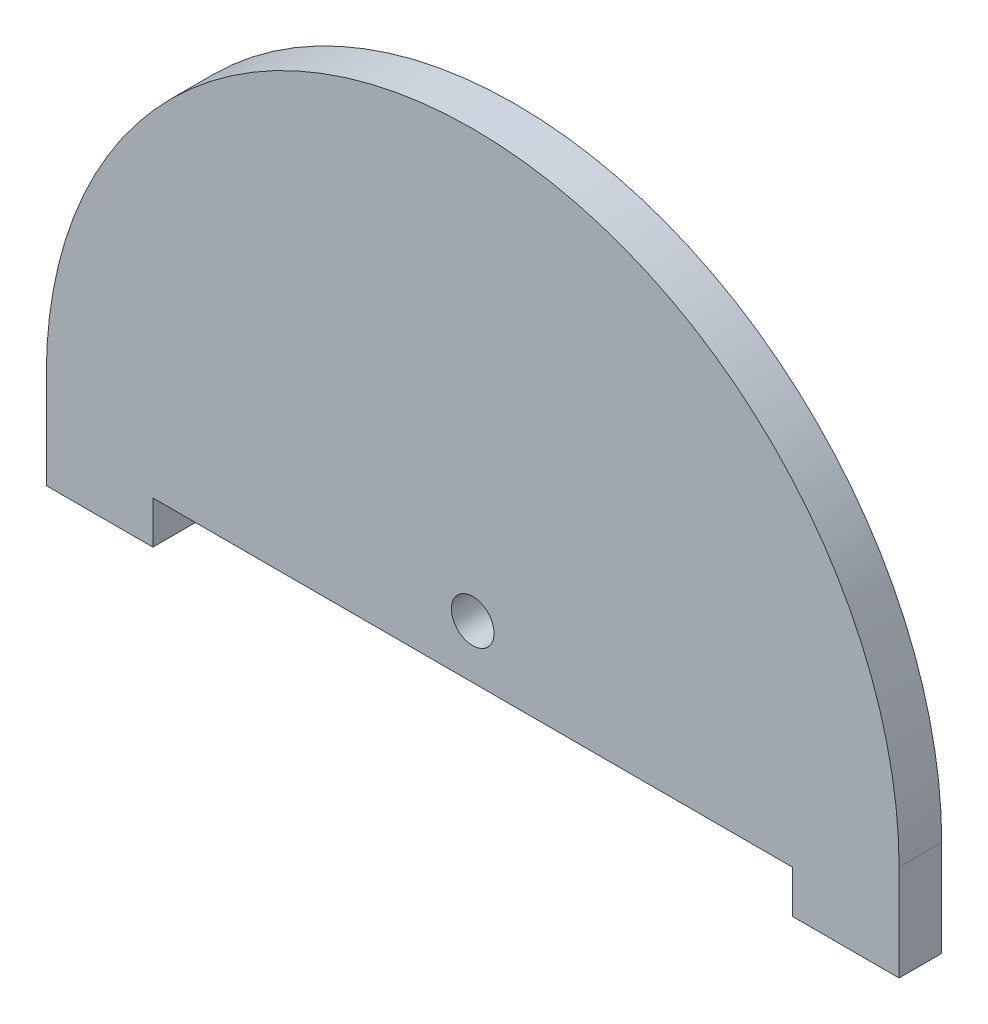
ISO-10303-21;
HEADER;
FILE_DESCRIPTION(('STEP AP214'),'2;1');
FILE_NAME('part.step','',(''),(''),'','','');
FILE_SCHEMA(('AUTOMOTIVE_DESIGN { 1 0 10303 214 1 1 1 1 }'));
ENDSEC;
DATA;
#1=APPLICATION_CONTEXT('core data for automotive mechanical design processes');
#2=APPLICATION_PROTOCOL_DEFINITION('international standard','automotive_design',2000,#1);
#3=PRODUCT_CONTEXT('',#1,'mechanical');
#4=PRODUCT('Part','Part','',(#3));
#5=PRODUCT_RELATED_PRODUCT_CATEGORY('part','',(#4));
#6=PRODUCT_DEFINITION_FORMATION('','',#4);
#7=PRODUCT_DEFINITION_CONTEXT('part definition',#1,'design');
#8=PRODUCT_DEFINITION('design','',#6,#7);
#9=PRODUCT_DEFINITION_SHAPE('','',#8);
#10=(LENGTH_UNIT() NAMED_UNIT(*) SI_UNIT(.MILLI.,.METRE.));
#11=(NAMED_UNIT(*) PLANE_ANGLE_UNIT() SI_UNIT($,.RADIAN.));
#12=(NAMED_UNIT(*) SI_UNIT($,.STERADIAN.) SOLID_ANGLE_UNIT());
#13=UNCERTAINTY_MEASURE_WITH_UNIT(LENGTH_MEASURE(1.E-05),#10,'distance_accuracy_value','');
#14=(GEOMETRIC_REPRESENTATION_CONTEXT(3) GLOBAL_UNCERTAINTY_ASSIGNED_CONTEXT((#13)) GLOBAL_UNIT_ASSIGNED_CONTEXT((#10,
#11,#12)) REPRESENTATION_CONTEXT('',''));
#15=CARTESIAN_POINT('',(0.,0.,0.));
#16=DIRECTION('',(0.,0.,1.));
#17=DIRECTION('',(1.,0.,0.));
#18=AXIS2_PLACEMENT_3D('',#15,#16,#17);
#19=CARTESIAN_POINT('',(0.,0.,8.));
#20=DIRECTION('',(0.,0.,-1.));
#21=DIRECTION('',(-1.,0.,0.));
#22=AXIS2_PLACEMENT_3D('',#19,#20,#21);
#23=CYLINDRICAL_SURFACE('',#22,80.);
#24=CARTESIAN_POINT('',(0.,0.,0.));
#25=DIRECTION('',(0.,0.,1.));
#26=DIRECTION('',(-1.,0.,0.));
#27=AXIS2_PLACEMENT_3D('',#24,#25,#26);
#28=CIRCLE('',#27,80.);
#29=CARTESIAN_POINT('',(80.,0.,0.));
#30=VERTEX_POINT('',#29);
#31=CARTESIAN_POINT('',(-80.,0.,0.));
#32=VERTEX_POINT('',#31);
#33=EDGE_CURVE('E164',#30,#32,#28,.T.);
#34=ORIENTED_EDGE('',*,*,#33,.T.);
#35=DIRECTION('',(0.,0.,-1.));
#36=VECTOR('',#35,1.);
#37=CARTESIAN_POINT('',(-80.,0.,8.));
#38=LINE('',#37,#36);
#39=CARTESIAN_POINT('',(-80.,0.,8.));
#40=VERTEX_POINT('',#39);
#41=EDGE_CURVE('E11',#40,#32,#38,.T.);
#42=ORIENTED_EDGE('',*,*,#41,.F.);
#43=CARTESIAN_POINT('',(0.,0.,8.));
#44=DIRECTION('',(0.,0.,1.));
#45=DIRECTION('',(-1.,0.,0.));
#46=AXIS2_PLACEMENT_3D('',#43,#44,#45);
#47=CIRCLE('',#46,80.);
#48=CARTESIAN_POINT('',(80.,0.,8.));
#49=VERTEX_POINT('',#48);
#50=EDGE_CURVE('E165',#49,#40,#47,.T.);
#51=ORIENTED_EDGE('',*,*,#50,.F.);
#52=DIRECTION('',(0.,0.,-1.));
#53=VECTOR('',#52,1.);
#54=CARTESIAN_POINT('',(80.,0.,8.));
#55=LINE('',#54,#53);
#56=EDGE_CURVE('E44',#49,#30,#55,.T.);
#57=ORIENTED_EDGE('',*,*,#56,.T.);
#58=EDGE_LOOP('',(#34,#42,#51,#57));
#59=FACE_BOUND('',#58,.T.);
#60=ADVANCED_FACE('F37',(#59),#23,.T.);
#61=CARTESIAN_POINT('',(0.,0.,8.));
#62=DIRECTION('',(0.,0.,-1.));
#63=DIRECTION('',(-1.,0.,0.));
#64=AXIS2_PLACEMENT_3D('',#61,#62,#63);
#65=PLANE('',#64);
#66=CARTESIAN_POINT('',(0.,0.,8.));
#67=DIRECTION('',(0.,0.,1.));
#68=DIRECTION('',(1.,0.,0.));
#69=AXIS2_PLACEMENT_3D('',#66,#67,#68);
#70=CIRCLE('',#69,4.);
#71=CARTESIAN_POINT('',(4.,0.,8.));
#72=VERTEX_POINT('',#71);
#73=EDGE_CURVE('E273',#72,#72,#70,.T.);
#74=ORIENTED_EDGE('',*,*,#73,.F.);
#75=EDGE_LOOP('',(#74));
#76=FACE_BOUND('',#75,.T.);
#77=ORIENTED_EDGE('',*,*,#50,.T.);
#78=DIRECTION('',(0.,1.,0.));
#79=VECTOR('',#78,1.);
#80=CARTESIAN_POINT('',(-80.,-10.,8.));
#81=LINE('',#80,#79);
#82=CARTESIAN_POINT('',(-80.,-18.,8.));
#83=VERTEX_POINT('',#82);
#84=EDGE_CURVE('E111',#83,#40,#81,.T.);
#85=ORIENTED_EDGE('',*,*,#84,.F.);
#86=DIRECTION('',(-1.,0.,0.));
#87=VECTOR('',#86,1.);
#88=CARTESIAN_POINT('',(-80.,-18.,8.));
#89=LINE('',#88,#87);
#90=CARTESIAN_POINT('',(-60.,-18.,8.));
#91=VERTEX_POINT('',#90);
#92=EDGE_CURVE('E144',#91,#83,#89,.T.);
#93=ORIENTED_EDGE('',*,*,#92,.F.);
#94=DIRECTION('',(0.,1.,0.));
#95=VECTOR('',#94,1.);
#96=CARTESIAN_POINT('',(-60.,-18.,8.));
#97=LINE('',#96,#95);
#98=CARTESIAN_POINT('',(-60.,-10.,8.));
#99=VERTEX_POINT('',#98);
#100=EDGE_CURVE('E147',#91,#99,#97,.T.);
#101=ORIENTED_EDGE('',*,*,#100,.T.);
#102=DIRECTION('',(-1.,0.,0.));
#103=VECTOR('',#102,1.);
#104=CARTESIAN_POINT('',(-80.,-10.,8.));
#105=LINE('',#104,#103);
#106=CARTESIAN_POINT('',(60.,-10.,8.));
#107=VERTEX_POINT('',#106);
#108=EDGE_CURVE('E156',#107,#99,#105,.T.);
#109=ORIENTED_EDGE('',*,*,#108,.F.);
#110=DIRECTION('',(0.,1.,0.));
#111=VECTOR('',#110,1.);
#112=CARTESIAN_POINT('',(60.,-18.,8.));
#113=LINE('',#112,#111);
#114=CARTESIAN_POINT('',(60.,-18.,8.));
#115=VERTEX_POINT('',#114);
#116=EDGE_CURVE('E124',#115,#107,#113,.T.);
#117=ORIENTED_EDGE('',*,*,#116,.F.);
#118=DIRECTION('',(1.,0.,0.));
#119=VECTOR('',#118,1.);
#120=CARTESIAN_POINT('',(80.,-18.,8.));
#121=LINE('',#120,#119);
#122=CARTESIAN_POINT('',(80.,-18.,8.));
#123=VERTEX_POINT('',#122);
#124=EDGE_CURVE('E117',#115,#123,#121,.T.);
#125=ORIENTED_EDGE('',*,*,#124,.T.);
#126=DIRECTION('',(0.,1.,0.));
#127=VECTOR('',#126,1.);
#128=CARTESIAN_POINT('',(80.,-10.,8.));
#129=LINE('',#128,#127);
#130=EDGE_CURVE('E101',#123,#49,#129,.T.);
#131=ORIENTED_EDGE('',*,*,#130,.T.);
#132=EDGE_LOOP('',(#77,#85,#93,#101,#109,#117,#125,#131));
#133=FACE_BOUND('',#132,.T.);
#134=ADVANCED_FACE('F122',(#76,#133),#65,.F.);
#135=CARTESIAN_POINT('',(0.,0.,0.));
#136=DIRECTION('',(0.,0.,-1.));
#137=DIRECTION('',(-1.,0.,0.));
#138=AXIS2_PLACEMENT_3D('',#135,#136,#137);
#139=PLANE('',#138);
#140=CARTESIAN_POINT('',(0.,0.,0.));
#141=DIRECTION('',(0.,0.,1.));
#142=DIRECTION('',(1.,0.,0.));
#143=AXIS2_PLACEMENT_3D('',#140,#141,#142);
#144=CIRCLE('',#143,4.);
#145=CARTESIAN_POINT('',(4.,0.,0.));
#146=VERTEX_POINT('',#145);
#147=EDGE_CURVE('E133',#146,#146,#144,.T.);
#148=ORIENTED_EDGE('',*,*,#147,.T.);
#149=EDGE_LOOP('',(#148));
#150=FACE_BOUND('',#149,.T.);
#151=ORIENTED_EDGE('',*,*,#33,.F.);
#152=DIRECTION('',(0.,1.,0.));
#153=VECTOR('',#152,1.);
#154=CARTESIAN_POINT('',(80.,-10.,0.));
#155=LINE('',#154,#153);
#156=CARTESIAN_POINT('',(80.,-18.,0.));
#157=VERTEX_POINT('',#156);
#158=EDGE_CURVE('E110',#157,#30,#155,.T.);
#159=ORIENTED_EDGE('',*,*,#158,.F.);
#160=DIRECTION('',(-1.,0.,0.));
#161=VECTOR('',#160,1.);
#162=CARTESIAN_POINT('',(80.,-18.,0.));
#163=LINE('',#162,#161);
#164=CARTESIAN_POINT('',(60.,-18.,0.));
#165=VERTEX_POINT('',#164);
#166=EDGE_CURVE('E120',#157,#165,#163,.T.);
#167=ORIENTED_EDGE('',*,*,#166,.T.);
#168=DIRECTION('',(0.,1.,0.));
#169=VECTOR('',#168,1.);
#170=CARTESIAN_POINT('',(60.,-18.,0.));
#171=LINE('',#170,#169);
#172=CARTESIAN_POINT('',(60.,-10.,0.));
#173=VERTEX_POINT('',#172);
#174=EDGE_CURVE('E131',#165,#173,#171,.T.);
#175=ORIENTED_EDGE('',*,*,#174,.T.);
#176=DIRECTION('',(1.,0.,0.));
#177=VECTOR('',#176,1.);
#178=CARTESIAN_POINT('',(-80.,-10.,0.));
#179=LINE('',#178,#177);
#180=CARTESIAN_POINT('',(-60.,-10.,0.));
#181=VERTEX_POINT('',#180);
#182=EDGE_CURVE('E56',#181,#173,#179,.T.);
#183=ORIENTED_EDGE('',*,*,#182,.F.);
#184=DIRECTION('',(0.,1.,0.));
#185=VECTOR('',#184,1.);
#186=CARTESIAN_POINT('',(-60.,-18.,0.));
#187=LINE('',#186,#185);
#188=CARTESIAN_POINT('',(-60.,-18.,0.));
#189=VERTEX_POINT('',#188);
#190=EDGE_CURVE('E152',#189,#181,#187,.T.);
#191=ORIENTED_EDGE('',*,*,#190,.F.);
#192=DIRECTION('',(1.,0.,0.));
#193=VECTOR('',#192,1.);
#194=CARTESIAN_POINT('',(-80.,-18.,0.));
#195=LINE('',#194,#193);
#196=CARTESIAN_POINT('',(-80.,-18.,0.));
#197=VERTEX_POINT('',#196);
#198=EDGE_CURVE('E140',#197,#189,#195,.T.);
#199=ORIENTED_EDGE('',*,*,#198,.F.);
#200=DIRECTION('',(0.,1.,0.));
#201=VECTOR('',#200,1.);
#202=CARTESIAN_POINT('',(-80.,-10.,0.));
#203=LINE('',#202,#201);
#204=EDGE_CURVE('E161',#197,#32,#203,.T.);
#205=ORIENTED_EDGE('',*,*,#204,.T.);
#206=EDGE_LOOP('',(#151,#159,#167,#175,#183,#191,#199,#205));
#207=FACE_BOUND('',#206,.T.);
#208=ADVANCED_FACE('F170',(#150,#207),#139,.T.);
#209=CARTESIAN_POINT('',(-80.,-10.,8.));
#210=DIRECTION('',(1.,0.,0.));
#211=DIRECTION('',(0.,0.,-1.));
#212=AXIS2_PLACEMENT_3D('',#209,#210,#211);
#213=PLANE('',#212);
#214=ORIENTED_EDGE('',*,*,#41,.T.);
#215=ORIENTED_EDGE('',*,*,#204,.F.);
#216=DIRECTION('',(0.,0.,-1.));
#217=VECTOR('',#216,1.);
#218=CARTESIAN_POINT('',(-80.,-18.,8.));
#219=LINE('',#218,#217);
#220=EDGE_CURVE('E137',#83,#197,#219,.T.);
#221=ORIENTED_EDGE('',*,*,#220,.F.);
#222=ORIENTED_EDGE('',*,*,#84,.T.);
#223=EDGE_LOOP('',(#214,#215,#221,#222));
#224=FACE_BOUND('',#223,.T.);
#225=ADVANCED_FACE('F175',(#224),#213,.F.);
#226=CARTESIAN_POINT('',(80.,-10.,8.));
#227=DIRECTION('',(-1.,0.,0.));
#228=DIRECTION('',(0.,0.,1.));
#229=AXIS2_PLACEMENT_3D('',#226,#227,#228);
#230=PLANE('',#229);
#231=ORIENTED_EDGE('',*,*,#56,.F.);
#232=ORIENTED_EDGE('',*,*,#130,.F.);
#233=DIRECTION('',(0.,0.,-1.));
#234=VECTOR('',#233,1.);
#235=CARTESIAN_POINT('',(80.,-18.,8.));
#236=LINE('',#235,#234);
#237=EDGE_CURVE('E105',#123,#157,#236,.T.);
#238=ORIENTED_EDGE('',*,*,#237,.T.);
#239=ORIENTED_EDGE('',*,*,#158,.T.);
#240=EDGE_LOOP('',(#231,#232,#238,#239));
#241=FACE_BOUND('',#240,.T.);
#242=ADVANCED_FACE('F103',(#241),#230,.F.);
#243=CARTESIAN_POINT('',(0.,-10.,0.));
#244=DIRECTION('',(0.,-1.,0.));
#245=DIRECTION('',(0.,0.,-1.));
#246=AXIS2_PLACEMENT_3D('',#243,#244,#245);
#247=PLANE('',#246);
#248=DIRECTION('',(0.,0.,1.));
#249=VECTOR('',#248,1.);
#250=CARTESIAN_POINT('',(60.,-10.,8.));
#251=LINE('',#250,#249);
#252=EDGE_CURVE('E51',#173,#107,#251,.T.);
#253=ORIENTED_EDGE('',*,*,#252,.T.);
#254=ORIENTED_EDGE('',*,*,#108,.T.);
#255=DIRECTION('',(0.,0.,1.));
#256=VECTOR('',#255,1.);
#257=CARTESIAN_POINT('',(-60.,-10.,8.));
#258=LINE('',#257,#256);
#259=EDGE_CURVE('E136',#181,#99,#258,.T.);
#260=ORIENTED_EDGE('',*,*,#259,.F.);
#261=ORIENTED_EDGE('',*,*,#182,.T.);
#262=EDGE_LOOP('',(#253,#254,#260,#261));
#263=FACE_BOUND('',#262,.T.);
#264=ADVANCED_FACE('F210',(#263),#247,.T.);
#265=CARTESIAN_POINT('',(-60.,-18.,8.));
#266=DIRECTION('',(-1.,0.,0.));
#267=DIRECTION('',(0.,0.,1.));
#268=AXIS2_PLACEMENT_3D('',#265,#266,#267);
#269=PLANE('',#268);
#270=ORIENTED_EDGE('',*,*,#259,.T.);
#271=ORIENTED_EDGE('',*,*,#100,.F.);
#272=DIRECTION('',(0.,0.,1.));
#273=VECTOR('',#272,1.);
#274=CARTESIAN_POINT('',(-60.,-18.,8.));
#275=LINE('',#274,#273);
#276=EDGE_CURVE('E142',#189,#91,#275,.T.);
#277=ORIENTED_EDGE('',*,*,#276,.F.);
#278=ORIENTED_EDGE('',*,*,#190,.T.);
#279=EDGE_LOOP('',(#270,#271,#277,#278));
#280=FACE_BOUND('',#279,.T.);
#281=ADVANCED_FACE('F182',(#280),#269,.F.);
#282=CARTESIAN_POINT('',(0.,-18.,0.));
#283=DIRECTION('',(0.,-1.,0.));
#284=DIRECTION('',(0.,0.,-1.));
#285=AXIS2_PLACEMENT_3D('',#282,#283,#284);
#286=PLANE('',#285);
#287=ORIENTED_EDGE('',*,*,#220,.T.);
#288=ORIENTED_EDGE('',*,*,#198,.T.);
#289=ORIENTED_EDGE('',*,*,#276,.T.);
#290=ORIENTED_EDGE('',*,*,#92,.T.);
#291=EDGE_LOOP('',(#287,#288,#289,#290));
#292=FACE_BOUND('',#291,.T.);
#293=ADVANCED_FACE('F178',(#292),#286,.T.);
#294=CARTESIAN_POINT('',(60.,-18.,8.));
#295=DIRECTION('',(-1.,0.,0.));
#296=DIRECTION('',(0.,0.,1.));
#297=AXIS2_PLACEMENT_3D('',#294,#295,#296);
#298=PLANE('',#297);
#299=ORIENTED_EDGE('',*,*,#252,.F.);
#300=ORIENTED_EDGE('',*,*,#174,.F.);
#301=DIRECTION('',(0.,0.,1.));
#302=VECTOR('',#301,1.);
#303=CARTESIAN_POINT('',(60.,-18.,8.));
#304=LINE('',#303,#302);
#305=EDGE_CURVE('E125',#165,#115,#304,.T.);
#306=ORIENTED_EDGE('',*,*,#305,.T.);
#307=ORIENTED_EDGE('',*,*,#116,.T.);
#308=EDGE_LOOP('',(#299,#300,#306,#307));
#309=FACE_BOUND('',#308,.T.);
#310=ADVANCED_FACE('F184',(#309),#298,.T.);
#311=CARTESIAN_POINT('',(0.,-18.,0.));
#312=DIRECTION('',(0.,-1.,0.));
#313=DIRECTION('',(0.,0.,-1.));
#314=AXIS2_PLACEMENT_3D('',#311,#312,#313);
#315=PLANE('',#314);
#316=ORIENTED_EDGE('',*,*,#237,.F.);
#317=ORIENTED_EDGE('',*,*,#124,.F.);
#318=ORIENTED_EDGE('',*,*,#305,.F.);
#319=ORIENTED_EDGE('',*,*,#166,.F.);
#320=EDGE_LOOP('',(#316,#317,#318,#319));
#321=FACE_BOUND('',#320,.T.);
#322=ADVANCED_FACE('F115',(#321),#315,.T.);
#323=CARTESIAN_POINT('',(0.,0.,0.));
#324=DIRECTION('',(0.,0.,1.));
#325=DIRECTION('',(1.,0.,0.));
#326=AXIS2_PLACEMENT_3D('',#323,#324,#325);
#327=CYLINDRICAL_SURFACE('',#326,4.);
#328=ORIENTED_EDGE('',*,*,#147,.F.);
#329=EDGE_LOOP('',(#328));
#330=FACE_BOUND('',#329,.T.);
#331=ORIENTED_EDGE('',*,*,#73,.T.);
#332=EDGE_LOOP('',(#331));
#333=FACE_BOUND('',#332,.T.);
#334=ADVANCED_FACE('F191',(#330,#333),#327,.F.);
#335=CLOSED_SHELL('',(#60,#134,#208,#225,#242,#264,#281,#293,#310,#322,#334));
#336=MANIFOLD_SOLID_BREP('B2',#335);
#337=ADVANCED_BREP_SHAPE_REPRESENTATION('',(#18,#336),#14);
#338=SHAPE_DEFINITION_REPRESENTATION(#9,#337);
ENDSEC;
END-ISO-10303-21;
